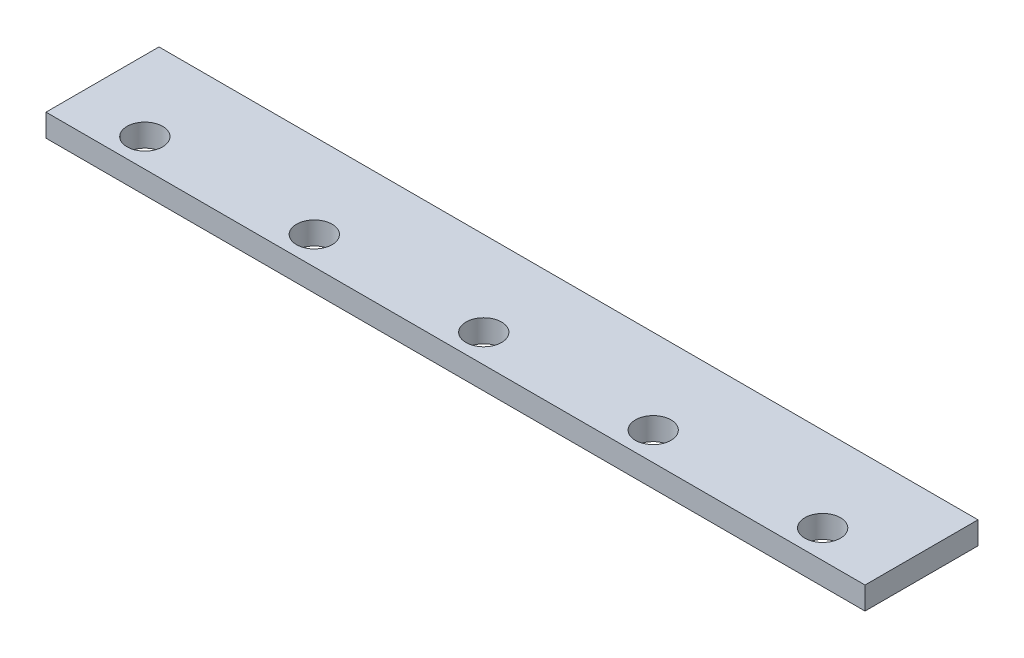
ISO-10303-21;
HEADER;
FILE_DESCRIPTION(('STEP AP214'),'2;1');
FILE_NAME('part.step','',(''),(''),'','','');
FILE_SCHEMA(('AUTOMOTIVE_DESIGN { 1 0 10303 214 1 1 1 1 }'));
ENDSEC;
DATA;
#1=APPLICATION_CONTEXT('core data for automotive mechanical design processes');
#2=APPLICATION_PROTOCOL_DEFINITION('international standard','automotive_design',2000,#1);
#3=PRODUCT_CONTEXT('',#1,'mechanical');
#4=PRODUCT('Part','Part','',(#3));
#5=PRODUCT_RELATED_PRODUCT_CATEGORY('part','',(#4));
#6=PRODUCT_DEFINITION_FORMATION('','',#4);
#7=PRODUCT_DEFINITION_CONTEXT('part definition',#1,'design');
#8=PRODUCT_DEFINITION('design','',#6,#7);
#9=PRODUCT_DEFINITION_SHAPE('','',#8);
#10=(LENGTH_UNIT() NAMED_UNIT(*) SI_UNIT(.MILLI.,.METRE.));
#11=(NAMED_UNIT(*) PLANE_ANGLE_UNIT() SI_UNIT($,.RADIAN.));
#12=(NAMED_UNIT(*) SI_UNIT($,.STERADIAN.) SOLID_ANGLE_UNIT());
#13=UNCERTAINTY_MEASURE_WITH_UNIT(LENGTH_MEASURE(1.E-05),#10,'distance_accuracy_value','');
#14=(GEOMETRIC_REPRESENTATION_CONTEXT(3) GLOBAL_UNCERTAINTY_ASSIGNED_CONTEXT((#13)) GLOBAL_UNIT_ASSIGNED_CONTEXT((#10,
#11,#12)) REPRESENTATION_CONTEXT('',''));
#15=CARTESIAN_POINT('',(0.,0.,0.));
#16=DIRECTION('',(0.,0.,1.));
#17=DIRECTION('',(1.,0.,0.));
#18=AXIS2_PLACEMENT_3D('',#15,#16,#17);
#19=CARTESIAN_POINT('',(0.,16.,0.));
#20=DIRECTION('',(0.,-1.,0.));
#21=DIRECTION('',(0.,0.,-1.));
#22=AXIS2_PLACEMENT_3D('',#19,#20,#21);
#23=PLANE('',#22);
#24=DIRECTION('',(0.,0.,1.));
#25=VECTOR('',#24,1.);
#26=CARTESIAN_POINT('',(0.,16.,0.));
#27=LINE('',#26,#25);
#28=CARTESIAN_POINT('',(0.,16.,-80.));
#29=VERTEX_POINT('',#28);
#30=CARTESIAN_POINT('',(0.,16.,0.));
#31=VERTEX_POINT('',#30);
#32=EDGE_CURVE('E85',#29,#31,#27,.T.);
#33=ORIENTED_EDGE('',*,*,#32,.T.);
#34=DIRECTION('',(1.,0.,0.));
#35=VECTOR('',#34,1.);
#36=CARTESIAN_POINT('',(0.,16.,0.));
#37=LINE('',#36,#35);
#38=CARTESIAN_POINT('',(580.,16.,0.));
#39=VERTEX_POINT('',#38);
#40=EDGE_CURVE('E80',#31,#39,#37,.T.);
#41=ORIENTED_EDGE('',*,*,#40,.T.);
#42=DIRECTION('',(0.,0.,-1.));
#43=VECTOR('',#42,1.);
#44=CARTESIAN_POINT('',(580.,16.,-80.));
#45=LINE('',#44,#43);
#46=CARTESIAN_POINT('',(580.,16.,-80.));
#47=VERTEX_POINT('',#46);
#48=EDGE_CURVE('E83',#39,#47,#45,.T.);
#49=ORIENTED_EDGE('',*,*,#48,.T.);
#50=DIRECTION('',(-1.,0.,0.));
#51=VECTOR('',#50,1.);
#52=CARTESIAN_POINT('',(0.,16.,-80.));
#53=LINE('',#52,#51);
#54=EDGE_CURVE('E50',#47,#29,#53,.T.);
#55=ORIENTED_EDGE('',*,*,#54,.T.);
#56=EDGE_LOOP('',(#33,#41,#49,#55));
#57=FACE_BOUND('',#56,.T.);
#58=CARTESIAN_POINT('',(50.,16.,-20.));
#59=DIRECTION('',(0.,1.,0.));
#60=DIRECTION('',(0.,0.,1.));
#61=AXIS2_PLACEMENT_3D('',#58,#59,#60);
#62=CIRCLE('',#61,12.6);
#63=CARTESIAN_POINT('',(50.,16.,-7.40000000000002));
#64=VERTEX_POINT('',#63);
#65=EDGE_CURVE('E100',#64,#64,#62,.T.);
#66=ORIENTED_EDGE('',*,*,#65,.F.);
#67=EDGE_LOOP('',(#66));
#68=FACE_BOUND('',#67,.T.);
#69=CARTESIAN_POINT('',(530.,16.,-20.));
#70=DIRECTION('',(0.,1.,0.));
#71=DIRECTION('',(0.,0.,1.));
#72=AXIS2_PLACEMENT_3D('',#69,#70,#71);
#73=CIRCLE('',#72,12.5999999999999);
#74=CARTESIAN_POINT('',(530.,16.,-7.40000000000006));
#75=VERTEX_POINT('',#74);
#76=EDGE_CURVE('E115',#75,#75,#73,.T.);
#77=ORIENTED_EDGE('',*,*,#76,.F.);
#78=EDGE_LOOP('',(#77));
#79=FACE_BOUND('',#78,.T.);
#80=CARTESIAN_POINT('',(410.,16.,-20.));
#81=DIRECTION('',(0.,1.,0.));
#82=DIRECTION('',(0.,0.,1.));
#83=AXIS2_PLACEMENT_3D('',#80,#81,#82);
#84=CIRCLE('',#83,12.6);
#85=CARTESIAN_POINT('',(410.,16.,-7.4));
#86=VERTEX_POINT('',#85);
#87=EDGE_CURVE('E121',#86,#86,#84,.T.);
#88=ORIENTED_EDGE('',*,*,#87,.F.);
#89=EDGE_LOOP('',(#88));
#90=FACE_BOUND('',#89,.T.);
#91=CARTESIAN_POINT('',(290.,16.,-20.));
#92=DIRECTION('',(0.,1.,0.));
#93=DIRECTION('',(0.,0.,1.));
#94=AXIS2_PLACEMENT_3D('',#91,#92,#93);
#95=CIRCLE('',#94,12.6);
#96=CARTESIAN_POINT('',(290.,16.,-7.4));
#97=VERTEX_POINT('',#96);
#98=EDGE_CURVE('E127',#97,#97,#95,.T.);
#99=ORIENTED_EDGE('',*,*,#98,.F.);
#100=EDGE_LOOP('',(#99));
#101=FACE_BOUND('',#100,.T.);
#102=CARTESIAN_POINT('',(170.,16.,-20.));
#103=DIRECTION('',(0.,1.,0.));
#104=DIRECTION('',(0.,0.,1.));
#105=AXIS2_PLACEMENT_3D('',#102,#103,#104);
#106=CIRCLE('',#105,12.6);
#107=CARTESIAN_POINT('',(170.,16.,-7.4));
#108=VERTEX_POINT('',#107);
#109=EDGE_CURVE('E133',#108,#108,#106,.T.);
#110=ORIENTED_EDGE('',*,*,#109,.F.);
#111=EDGE_LOOP('',(#110));
#112=FACE_BOUND('',#111,.T.);
#113=ADVANCED_FACE('F33',(#57,#68,#79,#90,#101,#112),#23,.F.);
#114=CARTESIAN_POINT('',(0.,0.,0.));
#115=DIRECTION('',(0.,-1.,0.));
#116=DIRECTION('',(0.,0.,-1.));
#117=AXIS2_PLACEMENT_3D('',#114,#115,#116);
#118=PLANE('',#117);
#119=CARTESIAN_POINT('',(290.,0.,-20.));
#120=DIRECTION('',(0.,1.,0.));
#121=DIRECTION('',(0.,0.,1.));
#122=AXIS2_PLACEMENT_3D('',#119,#120,#121);
#123=CIRCLE('',#122,12.6);
#124=CARTESIAN_POINT('',(290.,0.,-7.4));
#125=VERTEX_POINT('',#124);
#126=EDGE_CURVE('E130',#125,#125,#123,.T.);
#127=ORIENTED_EDGE('',*,*,#126,.T.);
#128=EDGE_LOOP('',(#127));
#129=FACE_BOUND('',#128,.T.);
#130=CARTESIAN_POINT('',(530.,0.,-20.));
#131=DIRECTION('',(0.,1.,0.));
#132=DIRECTION('',(0.,0.,1.));
#133=AXIS2_PLACEMENT_3D('',#130,#131,#132);
#134=CIRCLE('',#133,12.5999999999999);
#135=CARTESIAN_POINT('',(530.,0.,-7.40000000000006));
#136=VERTEX_POINT('',#135);
#137=EDGE_CURVE('E118',#136,#136,#134,.T.);
#138=ORIENTED_EDGE('',*,*,#137,.T.);
#139=EDGE_LOOP('',(#138));
#140=FACE_BOUND('',#139,.T.);
#141=DIRECTION('',(0.,0.,1.));
#142=VECTOR('',#141,1.);
#143=CARTESIAN_POINT('',(0.,0.,0.));
#144=LINE('',#143,#142);
#145=CARTESIAN_POINT('',(0.,0.,-80.));
#146=VERTEX_POINT('',#145);
#147=CARTESIAN_POINT('',(0.,0.,0.));
#148=VERTEX_POINT('',#147);
#149=EDGE_CURVE('E97',#146,#148,#144,.T.);
#150=ORIENTED_EDGE('',*,*,#149,.F.);
#151=DIRECTION('',(-1.,0.,0.));
#152=VECTOR('',#151,1.);
#153=CARTESIAN_POINT('',(0.,0.,-80.));
#154=LINE('',#153,#152);
#155=CARTESIAN_POINT('',(580.,0.,-80.));
#156=VERTEX_POINT('',#155);
#157=EDGE_CURVE('E73',#156,#146,#154,.T.);
#158=ORIENTED_EDGE('',*,*,#157,.F.);
#159=DIRECTION('',(0.,0.,-1.));
#160=VECTOR('',#159,1.);
#161=CARTESIAN_POINT('',(580.,0.,-80.));
#162=LINE('',#161,#160);
#163=CARTESIAN_POINT('',(580.,0.,0.));
#164=VERTEX_POINT('',#163);
#165=EDGE_CURVE('E67',#164,#156,#162,.T.);
#166=ORIENTED_EDGE('',*,*,#165,.F.);
#167=DIRECTION('',(1.,0.,0.));
#168=VECTOR('',#167,1.);
#169=CARTESIAN_POINT('',(0.,0.,0.));
#170=LINE('',#169,#168);
#171=EDGE_CURVE('E89',#148,#164,#170,.T.);
#172=ORIENTED_EDGE('',*,*,#171,.F.);
#173=EDGE_LOOP('',(#150,#158,#166,#172));
#174=FACE_BOUND('',#173,.T.);
#175=CARTESIAN_POINT('',(50.,0.,-20.));
#176=DIRECTION('',(0.,1.,0.));
#177=DIRECTION('',(0.,0.,1.));
#178=AXIS2_PLACEMENT_3D('',#175,#176,#177);
#179=CIRCLE('',#178,12.6);
#180=CARTESIAN_POINT('',(50.,0.,-7.40000000000002));
#181=VERTEX_POINT('',#180);
#182=EDGE_CURVE('E112',#181,#181,#179,.T.);
#183=ORIENTED_EDGE('',*,*,#182,.T.);
#184=EDGE_LOOP('',(#183));
#185=FACE_BOUND('',#184,.T.);
#186=CARTESIAN_POINT('',(410.,0.,-20.));
#187=DIRECTION('',(0.,1.,0.));
#188=DIRECTION('',(0.,0.,1.));
#189=AXIS2_PLACEMENT_3D('',#186,#187,#188);
#190=CIRCLE('',#189,12.6);
#191=CARTESIAN_POINT('',(410.,0.,-7.4));
#192=VERTEX_POINT('',#191);
#193=EDGE_CURVE('E124',#192,#192,#190,.T.);
#194=ORIENTED_EDGE('',*,*,#193,.T.);
#195=EDGE_LOOP('',(#194));
#196=FACE_BOUND('',#195,.T.);
#197=CARTESIAN_POINT('',(170.,0.,-20.));
#198=DIRECTION('',(0.,1.,0.));
#199=DIRECTION('',(0.,0.,1.));
#200=AXIS2_PLACEMENT_3D('',#197,#198,#199);
#201=CIRCLE('',#200,12.6);
#202=CARTESIAN_POINT('',(170.,0.,-7.4));
#203=VERTEX_POINT('',#202);
#204=EDGE_CURVE('E136',#203,#203,#201,.T.);
#205=ORIENTED_EDGE('',*,*,#204,.T.);
#206=EDGE_LOOP('',(#205));
#207=FACE_BOUND('',#206,.T.);
#208=ADVANCED_FACE('F108',(#129,#140,#174,#185,#196,#207),#118,.T.);
#209=CARTESIAN_POINT('',(0.,16.,0.));
#210=DIRECTION('',(1.,0.,0.));
#211=DIRECTION('',(0.,0.,-1.));
#212=AXIS2_PLACEMENT_3D('',#209,#210,#211);
#213=PLANE('',#212);
#214=ORIENTED_EDGE('',*,*,#149,.T.);
#215=DIRECTION('',(0.,-1.,0.));
#216=VECTOR('',#215,1.);
#217=CARTESIAN_POINT('',(0.,16.,0.));
#218=LINE('',#217,#216);
#219=EDGE_CURVE('E11',#31,#148,#218,.T.);
#220=ORIENTED_EDGE('',*,*,#219,.F.);
#221=ORIENTED_EDGE('',*,*,#32,.F.);
#222=DIRECTION('',(0.,-1.,0.));
#223=VECTOR('',#222,1.);
#224=CARTESIAN_POINT('',(0.,16.,-80.));
#225=LINE('',#224,#223);
#226=EDGE_CURVE('E93',#29,#146,#225,.T.);
#227=ORIENTED_EDGE('',*,*,#226,.T.);
#228=EDGE_LOOP('',(#214,#220,#221,#227));
#229=FACE_BOUND('',#228,.T.);
#230=ADVANCED_FACE('F35',(#229),#213,.F.);
#231=CARTESIAN_POINT('',(0.,16.,0.));
#232=DIRECTION('',(0.,0.,-1.));
#233=DIRECTION('',(-1.,0.,0.));
#234=AXIS2_PLACEMENT_3D('',#231,#232,#233);
#235=PLANE('',#234);
#236=ORIENTED_EDGE('',*,*,#171,.T.);
#237=DIRECTION('',(0.,-1.,0.));
#238=VECTOR('',#237,1.);
#239=CARTESIAN_POINT('',(580.,16.,0.));
#240=LINE('',#239,#238);
#241=EDGE_CURVE('E42',#39,#164,#240,.T.);
#242=ORIENTED_EDGE('',*,*,#241,.F.);
#243=ORIENTED_EDGE('',*,*,#40,.F.);
#244=ORIENTED_EDGE('',*,*,#219,.T.);
#245=EDGE_LOOP('',(#236,#242,#243,#244));
#246=FACE_BOUND('',#245,.T.);
#247=ADVANCED_FACE('F88',(#246),#235,.F.);
#248=CARTESIAN_POINT('',(580.,16.,-80.));
#249=DIRECTION('',(-1.,0.,0.));
#250=DIRECTION('',(0.,0.,1.));
#251=AXIS2_PLACEMENT_3D('',#248,#249,#250);
#252=PLANE('',#251);
#253=ORIENTED_EDGE('',*,*,#165,.T.);
#254=DIRECTION('',(0.,-1.,0.));
#255=VECTOR('',#254,1.);
#256=CARTESIAN_POINT('',(580.,16.,-80.));
#257=LINE('',#256,#255);
#258=EDGE_CURVE('E90',#47,#156,#257,.T.);
#259=ORIENTED_EDGE('',*,*,#258,.F.);
#260=ORIENTED_EDGE('',*,*,#48,.F.);
#261=ORIENTED_EDGE('',*,*,#241,.T.);
#262=EDGE_LOOP('',(#253,#259,#260,#261));
#263=FACE_BOUND('',#262,.T.);
#264=ADVANCED_FACE('F91',(#263),#252,.F.);
#265=CARTESIAN_POINT('',(0.,16.,-80.));
#266=DIRECTION('',(0.,0.,1.));
#267=DIRECTION('',(1.,0.,0.));
#268=AXIS2_PLACEMENT_3D('',#265,#266,#267);
#269=PLANE('',#268);
#270=ORIENTED_EDGE('',*,*,#157,.T.);
#271=ORIENTED_EDGE('',*,*,#226,.F.);
#272=ORIENTED_EDGE('',*,*,#54,.F.);
#273=ORIENTED_EDGE('',*,*,#258,.T.);
#274=EDGE_LOOP('',(#270,#271,#272,#273));
#275=FACE_BOUND('',#274,.T.);
#276=ADVANCED_FACE('F105',(#275),#269,.F.);
#277=CARTESIAN_POINT('',(50.,16.,-20.));
#278=DIRECTION('',(0.,-1.,0.));
#279=DIRECTION('',(0.,0.,-1.));
#280=AXIS2_PLACEMENT_3D('',#277,#278,#279);
#281=CYLINDRICAL_SURFACE('',#280,12.6);
#282=ORIENTED_EDGE('',*,*,#65,.T.);
#283=EDGE_LOOP('',(#282));
#284=FACE_BOUND('',#283,.T.);
#285=ORIENTED_EDGE('',*,*,#182,.F.);
#286=EDGE_LOOP('',(#285));
#287=FACE_BOUND('',#286,.T.);
#288=ADVANCED_FACE('F153',(#284,#287),#281,.F.);
#289=CARTESIAN_POINT('',(530.,16.,-20.));
#290=DIRECTION('',(0.,-1.,0.));
#291=DIRECTION('',(0.,0.,-1.));
#292=AXIS2_PLACEMENT_3D('',#289,#290,#291);
#293=CYLINDRICAL_SURFACE('',#292,12.5999999999999);
#294=ORIENTED_EDGE('',*,*,#76,.T.);
#295=EDGE_LOOP('',(#294));
#296=FACE_BOUND('',#295,.T.);
#297=ORIENTED_EDGE('',*,*,#137,.F.);
#298=EDGE_LOOP('',(#297));
#299=FACE_BOUND('',#298,.T.);
#300=ADVANCED_FACE('F199',(#296,#299),#293,.F.);
#301=CARTESIAN_POINT('',(410.,16.,-20.));
#302=DIRECTION('',(0.,-1.,0.));
#303=DIRECTION('',(0.,0.,-1.));
#304=AXIS2_PLACEMENT_3D('',#301,#302,#303);
#305=CYLINDRICAL_SURFACE('',#304,12.6);
#306=ORIENTED_EDGE('',*,*,#87,.T.);
#307=EDGE_LOOP('',(#306));
#308=FACE_BOUND('',#307,.T.);
#309=ORIENTED_EDGE('',*,*,#193,.F.);
#310=EDGE_LOOP('',(#309));
#311=FACE_BOUND('',#310,.T.);
#312=ADVANCED_FACE('F207',(#308,#311),#305,.F.);
#313=CARTESIAN_POINT('',(290.,16.,-20.));
#314=DIRECTION('',(0.,-1.,0.));
#315=DIRECTION('',(0.,0.,-1.));
#316=AXIS2_PLACEMENT_3D('',#313,#314,#315);
#317=CYLINDRICAL_SURFACE('',#316,12.6);
#318=ORIENTED_EDGE('',*,*,#98,.T.);
#319=EDGE_LOOP('',(#318));
#320=FACE_BOUND('',#319,.T.);
#321=ORIENTED_EDGE('',*,*,#126,.F.);
#322=EDGE_LOOP('',(#321));
#323=FACE_BOUND('',#322,.T.);
#324=ADVANCED_FACE('F215',(#320,#323),#317,.F.);
#325=CARTESIAN_POINT('',(170.,16.,-20.));
#326=DIRECTION('',(0.,-1.,0.));
#327=DIRECTION('',(0.,0.,-1.));
#328=AXIS2_PLACEMENT_3D('',#325,#326,#327);
#329=CYLINDRICAL_SURFACE('',#328,12.6);
#330=ORIENTED_EDGE('',*,*,#109,.T.);
#331=EDGE_LOOP('',(#330));
#332=FACE_BOUND('',#331,.T.);
#333=ORIENTED_EDGE('',*,*,#204,.F.);
#334=EDGE_LOOP('',(#333));
#335=FACE_BOUND('',#334,.T.);
#336=ADVANCED_FACE('F142',(#332,#335),#329,.F.);
#337=CLOSED_SHELL('',(#113,#208,#230,#247,#264,#276,#288,#300,#312,#324,#336));
#338=MANIFOLD_SOLID_BREP('B2',#337);
#339=ADVANCED_BREP_SHAPE_REPRESENTATION('',(#18,#338),#14);
#340=SHAPE_DEFINITION_REPRESENTATION(#9,#339);
ENDSEC;
END-ISO-10303-21;
